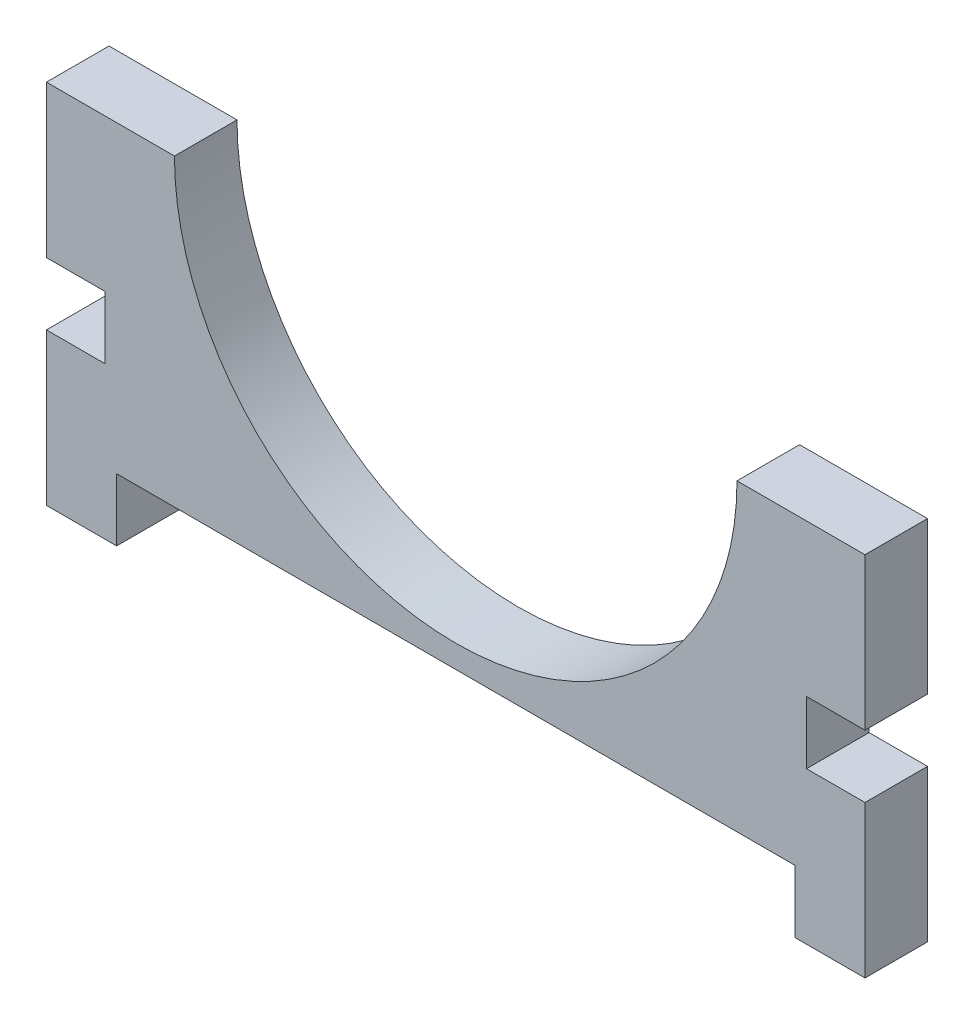
ISO-10303-21;
HEADER;
FILE_DESCRIPTION(('STEP AP214'),'2;1');
FILE_NAME('part.step','',(''),(''),'','','');
FILE_SCHEMA(('AUTOMOTIVE_DESIGN { 1 0 10303 214 1 1 1 1 }'));
ENDSEC;
DATA;
#1=APPLICATION_CONTEXT('core data for automotive mechanical design processes');
#2=APPLICATION_PROTOCOL_DEFINITION('international standard','automotive_design',2000,#1);
#3=PRODUCT_CONTEXT('',#1,'mechanical');
#4=PRODUCT('Part','Part','',(#3));
#5=PRODUCT_RELATED_PRODUCT_CATEGORY('part','',(#4));
#6=PRODUCT_DEFINITION_FORMATION('','',#4);
#7=PRODUCT_DEFINITION_CONTEXT('part definition',#1,'design');
#8=PRODUCT_DEFINITION('design','',#6,#7);
#9=PRODUCT_DEFINITION_SHAPE('','',#8);
#10=(LENGTH_UNIT() NAMED_UNIT(*) SI_UNIT(.MILLI.,.METRE.));
#11=(NAMED_UNIT(*) PLANE_ANGLE_UNIT() SI_UNIT($,.RADIAN.));
#12=(NAMED_UNIT(*) SI_UNIT($,.STERADIAN.) SOLID_ANGLE_UNIT());
#13=UNCERTAINTY_MEASURE_WITH_UNIT(LENGTH_MEASURE(1.E-05),#10,'distance_accuracy_value','');
#14=(GEOMETRIC_REPRESENTATION_CONTEXT(3) GLOBAL_UNCERTAINTY_ASSIGNED_CONTEXT((#13)) GLOBAL_UNIT_ASSIGNED_CONTEXT((#10,
#11,#12)) REPRESENTATION_CONTEXT('',''));
#15=CARTESIAN_POINT('',(0.,0.,0.));
#16=DIRECTION('',(0.,0.,1.));
#17=DIRECTION('',(1.,0.,0.));
#18=AXIS2_PLACEMENT_3D('',#15,#16,#17);
#19=CARTESIAN_POINT('',(-35.,-5.35,5.35));
#20=DIRECTION('',(0.,1.,0.));
#21=DIRECTION('',(0.,0.,1.));
#22=AXIS2_PLACEMENT_3D('',#19,#20,#21);
#23=PLANE('',#22);
#24=DIRECTION('',(1.,0.,0.));
#25=VECTOR('',#24,1.);
#26=CARTESIAN_POINT('',(-35.,-5.35,0.));
#27=LINE('',#26,#25);
#28=CARTESIAN_POINT('',(-35.,-5.35,0.));
#29=VERTEX_POINT('',#28);
#30=CARTESIAN_POINT('',(-29.,-5.35,0.));
#31=VERTEX_POINT('',#30);
#32=EDGE_CURVE('E192',#29,#31,#27,.T.);
#33=ORIENTED_EDGE('',*,*,#32,.T.);
#34=DIRECTION('',(0.,0.,-1.));
#35=VECTOR('',#34,1.);
#36=CARTESIAN_POINT('',(-29.,-5.35,5.35));
#37=LINE('',#36,#35);
#38=CARTESIAN_POINT('',(-29.,-5.35,5.35));
#39=VERTEX_POINT('',#38);
#40=EDGE_CURVE('E40',#39,#31,#37,.T.);
#41=ORIENTED_EDGE('',*,*,#40,.F.);
#42=DIRECTION('',(1.,0.,0.));
#43=VECTOR('',#42,1.);
#44=CARTESIAN_POINT('',(-35.,-5.35,5.35));
#45=LINE('',#44,#43);
#46=CARTESIAN_POINT('',(-35.,-5.35,5.35));
#47=VERTEX_POINT('',#46);
#48=EDGE_CURVE('E122',#47,#39,#45,.T.);
#49=ORIENTED_EDGE('',*,*,#48,.F.);
#50=DIRECTION('',(0.,0.,-1.));
#51=VECTOR('',#50,1.);
#52=CARTESIAN_POINT('',(-35.,-5.35,5.35));
#53=LINE('',#52,#51);
#54=EDGE_CURVE('E11',#47,#29,#53,.T.);
#55=ORIENTED_EDGE('',*,*,#54,.T.);
#56=EDGE_LOOP('',(#33,#41,#49,#55));
#57=FACE_BOUND('',#56,.T.);
#58=ADVANCED_FACE('F32',(#57),#23,.F.);
#59=CARTESIAN_POINT('',(-29.,0.,5.35));
#60=DIRECTION('',(-1.,0.,0.));
#61=DIRECTION('',(0.,-1.,0.));
#62=AXIS2_PLACEMENT_3D('',#59,#60,#61);
#63=PLANE('',#62);
#64=DIRECTION('',(0.,1.,0.));
#65=VECTOR('',#64,1.);
#66=CARTESIAN_POINT('',(-29.,0.,0.));
#67=LINE('',#66,#65);
#68=CARTESIAN_POINT('',(-29.,0.,0.));
#69=VERTEX_POINT('',#68);
#70=EDGE_CURVE('E194',#31,#69,#67,.T.);
#71=ORIENTED_EDGE('',*,*,#70,.T.);
#72=DIRECTION('',(0.,0.,-1.));
#73=VECTOR('',#72,1.);
#74=CARTESIAN_POINT('',(-29.,0.,5.35));
#75=LINE('',#74,#73);
#76=CARTESIAN_POINT('',(-29.,0.,5.35));
#77=VERTEX_POINT('',#76);
#78=EDGE_CURVE('E262',#77,#69,#75,.T.);
#79=ORIENTED_EDGE('',*,*,#78,.F.);
#80=DIRECTION('',(0.,1.,0.));
#81=VECTOR('',#80,1.);
#82=CARTESIAN_POINT('',(-29.,0.,5.35));
#83=LINE('',#82,#81);
#84=EDGE_CURVE('E270',#39,#77,#83,.T.);
#85=ORIENTED_EDGE('',*,*,#84,.F.);
#86=ORIENTED_EDGE('',*,*,#40,.T.);
#87=EDGE_LOOP('',(#71,#79,#85,#86));
#88=FACE_BOUND('',#87,.T.);
#89=ADVANCED_FACE('F268',(#88),#63,.F.);
#90=CARTESIAN_POINT('',(-29.,0.,5.35));
#91=DIRECTION('',(0.,1.,0.));
#92=DIRECTION('',(0.,0.,1.));
#93=AXIS2_PLACEMENT_3D('',#90,#91,#92);
#94=PLANE('',#93);
#95=DIRECTION('',(1.,0.,0.));
#96=VECTOR('',#95,1.);
#97=CARTESIAN_POINT('',(-29.,0.,0.));
#98=LINE('',#97,#96);
#99=CARTESIAN_POINT('',(29.,0.,0.));
#100=VERTEX_POINT('',#99);
#101=EDGE_CURVE('E196',#69,#100,#98,.T.);
#102=ORIENTED_EDGE('',*,*,#101,.T.);
#103=DIRECTION('',(0.,0.,-1.));
#104=VECTOR('',#103,1.);
#105=CARTESIAN_POINT('',(29.,0.,5.35));
#106=LINE('',#105,#104);
#107=CARTESIAN_POINT('',(29.,0.,5.35));
#108=VERTEX_POINT('',#107);
#109=EDGE_CURVE('E259',#108,#100,#106,.T.);
#110=ORIENTED_EDGE('',*,*,#109,.F.);
#111=DIRECTION('',(1.,0.,0.));
#112=VECTOR('',#111,1.);
#113=CARTESIAN_POINT('',(-29.,0.,5.35));
#114=LINE('',#113,#112);
#115=EDGE_CURVE('E289',#77,#108,#114,.T.);
#116=ORIENTED_EDGE('',*,*,#115,.F.);
#117=ORIENTED_EDGE('',*,*,#78,.T.);
#118=EDGE_LOOP('',(#102,#110,#116,#117));
#119=FACE_BOUND('',#118,.T.);
#120=ADVANCED_FACE('F280',(#119),#94,.F.);
#121=CARTESIAN_POINT('',(29.,0.,5.35));
#122=DIRECTION('',(1.,0.,0.));
#123=DIRECTION('',(0.,1.,0.));
#124=AXIS2_PLACEMENT_3D('',#121,#122,#123);
#125=PLANE('',#124);
#126=DIRECTION('',(0.,-1.,0.));
#127=VECTOR('',#126,1.);
#128=CARTESIAN_POINT('',(29.,0.,0.));
#129=LINE('',#128,#127);
#130=CARTESIAN_POINT('',(29.,-5.35,0.));
#131=VERTEX_POINT('',#130);
#132=EDGE_CURVE('E198',#100,#131,#129,.T.);
#133=ORIENTED_EDGE('',*,*,#132,.T.);
#134=DIRECTION('',(0.,0.,-1.));
#135=VECTOR('',#134,1.);
#136=CARTESIAN_POINT('',(29.,-5.35,5.35));
#137=LINE('',#136,#135);
#138=CARTESIAN_POINT('',(29.,-5.35,5.35));
#139=VERTEX_POINT('',#138);
#140=EDGE_CURVE('E256',#139,#131,#137,.T.);
#141=ORIENTED_EDGE('',*,*,#140,.F.);
#142=DIRECTION('',(0.,-1.,0.));
#143=VECTOR('',#142,1.);
#144=CARTESIAN_POINT('',(29.,0.,5.35));
#145=LINE('',#144,#143);
#146=EDGE_CURVE('E286',#108,#139,#145,.T.);
#147=ORIENTED_EDGE('',*,*,#146,.F.);
#148=ORIENTED_EDGE('',*,*,#109,.T.);
#149=EDGE_LOOP('',(#133,#141,#147,#148));
#150=FACE_BOUND('',#149,.T.);
#151=ADVANCED_FACE('F284',(#150),#125,.F.);
#152=CARTESIAN_POINT('',(35.,-5.35,5.35));
#153=DIRECTION('',(0.,1.,0.));
#154=DIRECTION('',(0.,0.,1.));
#155=AXIS2_PLACEMENT_3D('',#152,#153,#154);
#156=PLANE('',#155);
#157=DIRECTION('',(1.,0.,0.));
#158=VECTOR('',#157,1.);
#159=CARTESIAN_POINT('',(35.,-5.35,0.));
#160=LINE('',#159,#158);
#161=CARTESIAN_POINT('',(35.,-5.35,0.));
#162=VERTEX_POINT('',#161);
#163=EDGE_CURVE('E200',#131,#162,#160,.T.);
#164=ORIENTED_EDGE('',*,*,#163,.T.);
#165=DIRECTION('',(0.,0.,-1.));
#166=VECTOR('',#165,1.);
#167=CARTESIAN_POINT('',(35.,-5.35,5.35));
#168=LINE('',#167,#166);
#169=CARTESIAN_POINT('',(35.,-5.35,5.35));
#170=VERTEX_POINT('',#169);
#171=EDGE_CURVE('E253',#170,#162,#168,.T.);
#172=ORIENTED_EDGE('',*,*,#171,.F.);
#173=DIRECTION('',(1.,0.,0.));
#174=VECTOR('',#173,1.);
#175=CARTESIAN_POINT('',(35.,-5.35,5.35));
#176=LINE('',#175,#174);
#177=EDGE_CURVE('E288',#139,#170,#176,.T.);
#178=ORIENTED_EDGE('',*,*,#177,.F.);
#179=ORIENTED_EDGE('',*,*,#140,.T.);
#180=EDGE_LOOP('',(#164,#172,#178,#179));
#181=FACE_BOUND('',#180,.T.);
#182=ADVANCED_FACE('F343',(#181),#156,.F.);
#183=CARTESIAN_POINT('',(35.,-5.31754230471196,5.35));
#184=DIRECTION('',(-1.,0.,0.));
#185=DIRECTION('',(0.,-1.,0.));
#186=AXIS2_PLACEMENT_3D('',#183,#184,#185);
#187=PLANE('',#186);
#188=DIRECTION('',(0.,1.,0.));
#189=VECTOR('',#188,1.);
#190=CARTESIAN_POINT('',(35.,-5.31754230471196,0.));
#191=LINE('',#190,#189);
#192=CARTESIAN_POINT('',(35.,7.65,0.));
#193=VERTEX_POINT('',#192);
#194=EDGE_CURVE('E203',#162,#193,#191,.T.);
#195=ORIENTED_EDGE('',*,*,#194,.T.);
#196=DIRECTION('',(0.,0.,-1.));
#197=VECTOR('',#196,1.);
#198=CARTESIAN_POINT('',(35.,7.65,5.35));
#199=LINE('',#198,#197);
#200=CARTESIAN_POINT('',(35.,7.65,5.35));
#201=VERTEX_POINT('',#200);
#202=EDGE_CURVE('E250',#201,#193,#199,.T.);
#203=ORIENTED_EDGE('',*,*,#202,.F.);
#204=DIRECTION('',(-4.27565410441507E-13,1.,0.));
#205=VECTOR('',#204,1.);
#206=CARTESIAN_POINT('',(35.,-5.31754230471196,5.35));
#207=LINE('',#206,#205);
#208=EDGE_CURVE('E291',#170,#201,#207,.T.);
#209=ORIENTED_EDGE('',*,*,#208,.F.);
#210=ORIENTED_EDGE('',*,*,#171,.T.);
#211=EDGE_LOOP('',(#195,#203,#209,#210));
#212=FACE_BOUND('',#211,.T.);
#213=ADVANCED_FACE('F346',(#212),#187,.F.);
#214=CARTESIAN_POINT('',(35.,7.65,5.35));
#215=DIRECTION('',(0.,-1.,0.));
#216=DIRECTION('',(0.,0.,-1.));
#217=AXIS2_PLACEMENT_3D('',#214,#215,#216);
#218=PLANE('',#217);
#219=DIRECTION('',(-1.,0.,0.));
#220=VECTOR('',#219,1.);
#221=CARTESIAN_POINT('',(35.,7.65,0.));
#222=LINE('',#221,#220);
#223=CARTESIAN_POINT('',(30.,7.65,0.));
#224=VERTEX_POINT('',#223);
#225=EDGE_CURVE('E205',#193,#224,#222,.T.);
#226=ORIENTED_EDGE('',*,*,#225,.T.);
#227=DIRECTION('',(0.,0.,-1.));
#228=VECTOR('',#227,1.);
#229=CARTESIAN_POINT('',(30.,7.65,5.35));
#230=LINE('',#229,#228);
#231=CARTESIAN_POINT('',(30.,7.65,5.35));
#232=VERTEX_POINT('',#231);
#233=EDGE_CURVE('E247',#232,#224,#230,.T.);
#234=ORIENTED_EDGE('',*,*,#233,.F.);
#235=DIRECTION('',(-1.,0.,0.));
#236=VECTOR('',#235,1.);
#237=CARTESIAN_POINT('',(35.,7.65,5.35));
#238=LINE('',#237,#236);
#239=EDGE_CURVE('E297',#201,#232,#238,.T.);
#240=ORIENTED_EDGE('',*,*,#239,.F.);
#241=ORIENTED_EDGE('',*,*,#202,.T.);
#242=EDGE_LOOP('',(#226,#234,#240,#241));
#243=FACE_BOUND('',#242,.T.);
#244=ADVANCED_FACE('F350',(#243),#218,.F.);
#245=CARTESIAN_POINT('',(30.,13.,5.35));
#246=DIRECTION('',(-1.,0.,0.));
#247=DIRECTION('',(0.,0.,1.));
#248=AXIS2_PLACEMENT_3D('',#245,#246,#247);
#249=PLANE('',#248);
#250=DIRECTION('',(0.,1.,0.));
#251=VECTOR('',#250,1.);
#252=CARTESIAN_POINT('',(30.,13.,0.));
#253=LINE('',#252,#251);
#254=CARTESIAN_POINT('',(30.,13.,0.));
#255=VERTEX_POINT('',#254);
#256=EDGE_CURVE('E207',#224,#255,#253,.T.);
#257=ORIENTED_EDGE('',*,*,#256,.T.);
#258=DIRECTION('',(0.,0.,-1.));
#259=VECTOR('',#258,1.);
#260=CARTESIAN_POINT('',(30.,13.,5.35));
#261=LINE('',#260,#259);
#262=CARTESIAN_POINT('',(30.,13.,5.35));
#263=VERTEX_POINT('',#262);
#264=EDGE_CURVE('E244',#263,#255,#261,.T.);
#265=ORIENTED_EDGE('',*,*,#264,.F.);
#266=DIRECTION('',(0.,1.,0.));
#267=VECTOR('',#266,1.);
#268=CARTESIAN_POINT('',(30.,13.,5.35));
#269=LINE('',#268,#267);
#270=EDGE_CURVE('E299',#232,#263,#269,.T.);
#271=ORIENTED_EDGE('',*,*,#270,.F.);
#272=ORIENTED_EDGE('',*,*,#233,.T.);
#273=EDGE_LOOP('',(#257,#265,#271,#272));
#274=FACE_BOUND('',#273,.T.);
#275=ADVANCED_FACE('F354',(#274),#249,.F.);
#276=CARTESIAN_POINT('',(35.,13.,5.35));
#277=DIRECTION('',(0.,1.,0.));
#278=DIRECTION('',(0.,0.,1.));
#279=AXIS2_PLACEMENT_3D('',#276,#277,#278);
#280=PLANE('',#279);
#281=DIRECTION('',(1.,0.,0.));
#282=VECTOR('',#281,1.);
#283=CARTESIAN_POINT('',(35.,13.,0.));
#284=LINE('',#283,#282);
#285=CARTESIAN_POINT('',(35.,13.,0.));
#286=VERTEX_POINT('',#285);
#287=EDGE_CURVE('E209',#255,#286,#284,.T.);
#288=ORIENTED_EDGE('',*,*,#287,.T.);
#289=DIRECTION('',(0.,0.,-1.));
#290=VECTOR('',#289,1.);
#291=CARTESIAN_POINT('',(35.,13.,5.35));
#292=LINE('',#291,#290);
#293=CARTESIAN_POINT('',(35.,13.,5.35));
#294=VERTEX_POINT('',#293);
#295=EDGE_CURVE('E241',#294,#286,#292,.T.);
#296=ORIENTED_EDGE('',*,*,#295,.F.);
#297=DIRECTION('',(1.,0.,0.));
#298=VECTOR('',#297,1.);
#299=CARTESIAN_POINT('',(35.,13.,5.35));
#300=LINE('',#299,#298);
#301=EDGE_CURVE('E301',#263,#294,#300,.T.);
#302=ORIENTED_EDGE('',*,*,#301,.F.);
#303=ORIENTED_EDGE('',*,*,#264,.T.);
#304=EDGE_LOOP('',(#288,#296,#302,#303));
#305=FACE_BOUND('',#304,.T.);
#306=ADVANCED_FACE('F358',(#305),#280,.F.);
#307=CARTESIAN_POINT('',(35.,13.,5.35));
#308=DIRECTION('',(-1.,0.,0.));
#309=DIRECTION('',(0.,0.,1.));
#310=AXIS2_PLACEMENT_3D('',#307,#308,#309);
#311=PLANE('',#310);
#312=DIRECTION('',(0.,1.,0.));
#313=VECTOR('',#312,1.);
#314=CARTESIAN_POINT('',(35.,13.,0.));
#315=LINE('',#314,#313);
#316=CARTESIAN_POINT('',(35.,26.,0.));
#317=VERTEX_POINT('',#316);
#318=EDGE_CURVE('E211',#286,#317,#315,.T.);
#319=ORIENTED_EDGE('',*,*,#318,.T.);
#320=DIRECTION('',(0.,0.,-1.));
#321=VECTOR('',#320,1.);
#322=CARTESIAN_POINT('',(35.,26.,5.35));
#323=LINE('',#322,#321);
#324=CARTESIAN_POINT('',(35.,26.,5.35));
#325=VERTEX_POINT('',#324);
#326=EDGE_CURVE('E238',#325,#317,#323,.T.);
#327=ORIENTED_EDGE('',*,*,#326,.F.);
#328=DIRECTION('',(0.,1.,0.));
#329=VECTOR('',#328,1.);
#330=CARTESIAN_POINT('',(35.,13.,5.35));
#331=LINE('',#330,#329);
#332=EDGE_CURVE('E303',#294,#325,#331,.T.);
#333=ORIENTED_EDGE('',*,*,#332,.F.);
#334=ORIENTED_EDGE('',*,*,#295,.T.);
#335=EDGE_LOOP('',(#319,#327,#333,#334));
#336=FACE_BOUND('',#335,.T.);
#337=ADVANCED_FACE('F362',(#336),#311,.F.);
#338=CARTESIAN_POINT('',(24.055,26.,5.35));
#339=DIRECTION('',(0.,-1.,0.));
#340=DIRECTION('',(1.,0.,0.));
#341=AXIS2_PLACEMENT_3D('',#338,#339,#340);
#342=PLANE('',#341);
#343=DIRECTION('',(-1.,0.,0.));
#344=VECTOR('',#343,1.);
#345=CARTESIAN_POINT('',(24.055,26.,0.));
#346=LINE('',#345,#344);
#347=CARTESIAN_POINT('',(24.055,26.,0.));
#348=VERTEX_POINT('',#347);
#349=EDGE_CURVE('E213',#317,#348,#346,.T.);
#350=ORIENTED_EDGE('',*,*,#349,.T.);
#351=DIRECTION('',(0.,0.,-1.));
#352=VECTOR('',#351,1.);
#353=CARTESIAN_POINT('',(24.055,26.,5.35));
#354=LINE('',#353,#352);
#355=CARTESIAN_POINT('',(24.055,26.,5.35));
#356=VERTEX_POINT('',#355);
#357=EDGE_CURVE('E235',#356,#348,#354,.T.);
#358=ORIENTED_EDGE('',*,*,#357,.F.);
#359=DIRECTION('',(-1.,0.,0.));
#360=VECTOR('',#359,1.);
#361=CARTESIAN_POINT('',(24.055,26.,5.35));
#362=LINE('',#361,#360);
#363=EDGE_CURVE('E305',#325,#356,#362,.T.);
#364=ORIENTED_EDGE('',*,*,#363,.F.);
#365=ORIENTED_EDGE('',*,*,#326,.T.);
#366=EDGE_LOOP('',(#350,#358,#364,#365));
#367=FACE_BOUND('',#366,.T.);
#368=ADVANCED_FACE('F366',(#367),#342,.F.);
#369=CARTESIAN_POINT('',(0.,26.,5.35));
#370=DIRECTION('',(0.,0.,-1.));
#371=DIRECTION('',(-1.,0.,0.));
#372=AXIS2_PLACEMENT_3D('',#369,#370,#371);
#373=CYLINDRICAL_SURFACE('',#372,24.055);
#374=CARTESIAN_POINT('',(0.,26.,0.));
#375=DIRECTION('',(0.,0.,-1.));
#376=DIRECTION('',(1.,0.,0.));
#377=AXIS2_PLACEMENT_3D('',#374,#375,#376);
#378=CIRCLE('',#377,24.055);
#379=CARTESIAN_POINT('',(-24.055,26.,0.));
#380=VERTEX_POINT('',#379);
#381=EDGE_CURVE('E215',#348,#380,#378,.T.);
#382=ORIENTED_EDGE('',*,*,#381,.T.);
#383=DIRECTION('',(0.,0.,-1.));
#384=VECTOR('',#383,1.);
#385=CARTESIAN_POINT('',(-24.055,26.,5.35));
#386=LINE('',#385,#384);
#387=CARTESIAN_POINT('',(-24.055,26.,5.35));
#388=VERTEX_POINT('',#387);
#389=EDGE_CURVE('E232',#388,#380,#386,.T.);
#390=ORIENTED_EDGE('',*,*,#389,.F.);
#391=CARTESIAN_POINT('',(0.,26.,5.35));
#392=DIRECTION('',(0.,0.,-1.));
#393=DIRECTION('',(1.,0.,0.));
#394=AXIS2_PLACEMENT_3D('',#391,#392,#393);
#395=CIRCLE('',#394,24.055);
#396=EDGE_CURVE('E307',#356,#388,#395,.T.);
#397=ORIENTED_EDGE('',*,*,#396,.F.);
#398=ORIENTED_EDGE('',*,*,#357,.T.);
#399=EDGE_LOOP('',(#382,#390,#397,#398));
#400=FACE_BOUND('',#399,.T.);
#401=ADVANCED_FACE('F370',(#400),#373,.F.);
#402=CARTESIAN_POINT('',(-35.,26.,5.35));
#403=DIRECTION('',(0.,-1.,0.));
#404=DIRECTION('',(1.,0.,0.));
#405=AXIS2_PLACEMENT_3D('',#402,#403,#404);
#406=PLANE('',#405);
#407=DIRECTION('',(-1.,0.,0.));
#408=VECTOR('',#407,1.);
#409=CARTESIAN_POINT('',(-35.,26.,0.));
#410=LINE('',#409,#408);
#411=CARTESIAN_POINT('',(-35.,26.,0.));
#412=VERTEX_POINT('',#411);
#413=EDGE_CURVE('E217',#380,#412,#410,.T.);
#414=ORIENTED_EDGE('',*,*,#413,.T.);
#415=DIRECTION('',(0.,0.,-1.));
#416=VECTOR('',#415,1.);
#417=CARTESIAN_POINT('',(-35.,26.,5.35));
#418=LINE('',#417,#416);
#419=CARTESIAN_POINT('',(-35.,26.,5.35));
#420=VERTEX_POINT('',#419);
#421=EDGE_CURVE('E229',#420,#412,#418,.T.);
#422=ORIENTED_EDGE('',*,*,#421,.F.);
#423=DIRECTION('',(-1.,0.,0.));
#424=VECTOR('',#423,1.);
#425=CARTESIAN_POINT('',(-35.,26.,5.35));
#426=LINE('',#425,#424);
#427=EDGE_CURVE('E309',#388,#420,#426,.T.);
#428=ORIENTED_EDGE('',*,*,#427,.F.);
#429=ORIENTED_EDGE('',*,*,#389,.T.);
#430=EDGE_LOOP('',(#414,#422,#428,#429));
#431=FACE_BOUND('',#430,.T.);
#432=ADVANCED_FACE('F315',(#431),#406,.F.);
#433=CARTESIAN_POINT('',(-35.,13.,5.35));
#434=DIRECTION('',(1.,0.,0.));
#435=DIRECTION('',(0.,0.,-1.));
#436=AXIS2_PLACEMENT_3D('',#433,#434,#435);
#437=PLANE('',#436);
#438=DIRECTION('',(0.,-1.,0.));
#439=VECTOR('',#438,1.);
#440=CARTESIAN_POINT('',(-35.,13.,0.));
#441=LINE('',#440,#439);
#442=CARTESIAN_POINT('',(-35.,13.,0.));
#443=VERTEX_POINT('',#442);
#444=EDGE_CURVE('E219',#412,#443,#441,.T.);
#445=ORIENTED_EDGE('',*,*,#444,.T.);
#446=DIRECTION('',(0.,0.,-1.));
#447=VECTOR('',#446,1.);
#448=CARTESIAN_POINT('',(-35.,13.,5.35));
#449=LINE('',#448,#447);
#450=CARTESIAN_POINT('',(-35.,13.,5.35));
#451=VERTEX_POINT('',#450);
#452=EDGE_CURVE('E181',#451,#443,#449,.T.);
#453=ORIENTED_EDGE('',*,*,#452,.F.);
#454=DIRECTION('',(0.,-1.,0.));
#455=VECTOR('',#454,1.);
#456=CARTESIAN_POINT('',(-35.,13.,5.35));
#457=LINE('',#456,#455);
#458=EDGE_CURVE('E172',#420,#451,#457,.T.);
#459=ORIENTED_EDGE('',*,*,#458,.F.);
#460=ORIENTED_EDGE('',*,*,#421,.T.);
#461=EDGE_LOOP('',(#445,#453,#459,#460));
#462=FACE_BOUND('',#461,.T.);
#463=ADVANCED_FACE('F319',(#462),#437,.F.);
#464=CARTESIAN_POINT('',(-35.,13.,5.35));
#465=DIRECTION('',(0.,1.,0.));
#466=DIRECTION('',(0.,0.,1.));
#467=AXIS2_PLACEMENT_3D('',#464,#465,#466);
#468=PLANE('',#467);
#469=DIRECTION('',(1.,0.,0.));
#470=VECTOR('',#469,1.);
#471=CARTESIAN_POINT('',(-35.,13.,0.));
#472=LINE('',#471,#470);
#473=CARTESIAN_POINT('',(-30.,13.,0.));
#474=VERTEX_POINT('',#473);
#475=EDGE_CURVE('E180',#443,#474,#472,.T.);
#476=ORIENTED_EDGE('',*,*,#475,.T.);
#477=DIRECTION('',(0.,0.,-1.));
#478=VECTOR('',#477,1.);
#479=CARTESIAN_POINT('',(-30.,13.,5.35));
#480=LINE('',#479,#478);
#481=CARTESIAN_POINT('',(-30.,13.,5.35));
#482=VERTEX_POINT('',#481);
#483=EDGE_CURVE('E177',#482,#474,#480,.T.);
#484=ORIENTED_EDGE('',*,*,#483,.F.);
#485=DIRECTION('',(1.,0.,0.));
#486=VECTOR('',#485,1.);
#487=CARTESIAN_POINT('',(-35.,13.,5.35));
#488=LINE('',#487,#486);
#489=EDGE_CURVE('E166',#451,#482,#488,.T.);
#490=ORIENTED_EDGE('',*,*,#489,.F.);
#491=ORIENTED_EDGE('',*,*,#452,.T.);
#492=EDGE_LOOP('',(#476,#484,#490,#491));
#493=FACE_BOUND('',#492,.T.);
#494=ADVANCED_FACE('F178',(#493),#468,.F.);
#495=CARTESIAN_POINT('',(-30.,13.,5.35));
#496=DIRECTION('',(1.,0.,0.));
#497=DIRECTION('',(0.,0.,-1.));
#498=AXIS2_PLACEMENT_3D('',#495,#496,#497);
#499=PLANE('',#498);
#500=DIRECTION('',(0.,-1.,0.));
#501=VECTOR('',#500,1.);
#502=CARTESIAN_POINT('',(-30.,13.,0.));
#503=LINE('',#502,#501);
#504=CARTESIAN_POINT('',(-30.,7.65,0.));
#505=VERTEX_POINT('',#504);
#506=EDGE_CURVE('E108',#474,#505,#503,.T.);
#507=ORIENTED_EDGE('',*,*,#506,.T.);
#508=DIRECTION('',(0.,0.,-1.));
#509=VECTOR('',#508,1.);
#510=CARTESIAN_POINT('',(-30.,7.65,5.35));
#511=LINE('',#510,#509);
#512=CARTESIAN_POINT('',(-30.,7.65,5.35));
#513=VERTEX_POINT('',#512);
#514=EDGE_CURVE('E182',#513,#505,#511,.T.);
#515=ORIENTED_EDGE('',*,*,#514,.F.);
#516=DIRECTION('',(0.,-1.,0.));
#517=VECTOR('',#516,1.);
#518=CARTESIAN_POINT('',(-30.,13.,5.35));
#519=LINE('',#518,#517);
#520=EDGE_CURVE('E170',#482,#513,#519,.T.);
#521=ORIENTED_EDGE('',*,*,#520,.F.);
#522=ORIENTED_EDGE('',*,*,#483,.T.);
#523=EDGE_LOOP('',(#507,#515,#521,#522));
#524=FACE_BOUND('',#523,.T.);
#525=ADVANCED_FACE('F184',(#524),#499,.F.);
#526=CARTESIAN_POINT('',(-35.,7.65,5.35));
#527=DIRECTION('',(0.,-1.,0.));
#528=DIRECTION('',(0.,0.,-1.));
#529=AXIS2_PLACEMENT_3D('',#526,#527,#528);
#530=PLANE('',#529);
#531=DIRECTION('',(-1.,0.,0.));
#532=VECTOR('',#531,1.);
#533=CARTESIAN_POINT('',(-35.,7.65,0.));
#534=LINE('',#533,#532);
#535=CARTESIAN_POINT('',(-35.,7.65,0.));
#536=VERTEX_POINT('',#535);
#537=EDGE_CURVE('E115',#505,#536,#534,.T.);
#538=ORIENTED_EDGE('',*,*,#537,.T.);
#539=DIRECTION('',(0.,0.,-1.));
#540=VECTOR('',#539,1.);
#541=CARTESIAN_POINT('',(-35.,7.65,5.35));
#542=LINE('',#541,#540);
#543=CARTESIAN_POINT('',(-35.,7.65,5.35));
#544=VERTEX_POINT('',#543);
#545=EDGE_CURVE('E188',#544,#536,#542,.T.);
#546=ORIENTED_EDGE('',*,*,#545,.F.);
#547=DIRECTION('',(-1.,0.,0.));
#548=VECTOR('',#547,1.);
#549=CARTESIAN_POINT('',(-35.,7.65,5.35));
#550=LINE('',#549,#548);
#551=EDGE_CURVE('E186',#513,#544,#550,.T.);
#552=ORIENTED_EDGE('',*,*,#551,.F.);
#553=ORIENTED_EDGE('',*,*,#514,.T.);
#554=EDGE_LOOP('',(#538,#546,#552,#553));
#555=FACE_BOUND('',#554,.T.);
#556=ADVANCED_FACE('F321',(#555),#530,.F.);
#557=CARTESIAN_POINT('',(-35.,-5.31754230471196,5.35));
#558=DIRECTION('',(1.,0.,0.));
#559=DIRECTION('',(0.,0.,-1.));
#560=AXIS2_PLACEMENT_3D('',#557,#558,#559);
#561=PLANE('',#560);
#562=DIRECTION('',(0.,-1.,0.));
#563=VECTOR('',#562,1.);
#564=CARTESIAN_POINT('',(-35.,-5.31754230471196,0.));
#565=LINE('',#564,#563);
#566=EDGE_CURVE('E224',#536,#29,#565,.T.);
#567=ORIENTED_EDGE('',*,*,#566,.T.);
#568=ORIENTED_EDGE('',*,*,#54,.F.);
#569=DIRECTION('',(4.27565410441415E-13,-1.,0.));
#570=VECTOR('',#569,1.);
#571=CARTESIAN_POINT('',(-35.,-5.31754230471196,5.35));
#572=LINE('',#571,#570);
#573=EDGE_CURVE('E48',#544,#47,#572,.T.);
#574=ORIENTED_EDGE('',*,*,#573,.F.);
#575=ORIENTED_EDGE('',*,*,#545,.T.);
#576=EDGE_LOOP('',(#567,#568,#574,#575));
#577=FACE_BOUND('',#576,.T.);
#578=ADVANCED_FACE('F320',(#577),#561,.F.);
#579=CARTESIAN_POINT('',(0.,26.,5.35));
#580=DIRECTION('',(0.,0.,1.));
#581=DIRECTION('',(1.,0.,0.));
#582=AXIS2_PLACEMENT_3D('',#579,#580,#581);
#583=PLANE('',#582);
#584=ORIENTED_EDGE('',*,*,#573,.T.);
#585=ORIENTED_EDGE('',*,*,#48,.T.);
#586=ORIENTED_EDGE('',*,*,#84,.T.);
#587=ORIENTED_EDGE('',*,*,#115,.T.);
#588=ORIENTED_EDGE('',*,*,#146,.T.);
#589=ORIENTED_EDGE('',*,*,#177,.T.);
#590=ORIENTED_EDGE('',*,*,#208,.T.);
#591=ORIENTED_EDGE('',*,*,#239,.T.);
#592=ORIENTED_EDGE('',*,*,#270,.T.);
#593=ORIENTED_EDGE('',*,*,#301,.T.);
#594=ORIENTED_EDGE('',*,*,#332,.T.);
#595=ORIENTED_EDGE('',*,*,#363,.T.);
#596=ORIENTED_EDGE('',*,*,#396,.T.);
#597=ORIENTED_EDGE('',*,*,#427,.T.);
#598=ORIENTED_EDGE('',*,*,#458,.T.);
#599=ORIENTED_EDGE('',*,*,#489,.T.);
#600=ORIENTED_EDGE('',*,*,#520,.T.);
#601=ORIENTED_EDGE('',*,*,#551,.T.);
#602=EDGE_LOOP('',(#584,#585,#586,#587,#588,#589,#590,#591,#592,#593,#594,#595,#596,#597,#598,
#599,#600,#601));
#603=FACE_BOUND('',#602,.T.);
#604=ADVANCED_FACE('F168',(#603),#583,.T.);
#605=CARTESIAN_POINT('',(0.,26.,0.));
#606=DIRECTION('',(0.,0.,1.));
#607=DIRECTION('',(1.,0.,0.));
#608=AXIS2_PLACEMENT_3D('',#605,#606,#607);
#609=PLANE('',#608);
#610=ORIENTED_EDGE('',*,*,#32,.F.);
#611=ORIENTED_EDGE('',*,*,#566,.F.);
#612=ORIENTED_EDGE('',*,*,#537,.F.);
#613=ORIENTED_EDGE('',*,*,#506,.F.);
#614=ORIENTED_EDGE('',*,*,#475,.F.);
#615=ORIENTED_EDGE('',*,*,#444,.F.);
#616=ORIENTED_EDGE('',*,*,#413,.F.);
#617=ORIENTED_EDGE('',*,*,#381,.F.);
#618=ORIENTED_EDGE('',*,*,#349,.F.);
#619=ORIENTED_EDGE('',*,*,#318,.F.);
#620=ORIENTED_EDGE('',*,*,#287,.F.);
#621=ORIENTED_EDGE('',*,*,#256,.F.);
#622=ORIENTED_EDGE('',*,*,#225,.F.);
#623=ORIENTED_EDGE('',*,*,#194,.F.);
#624=ORIENTED_EDGE('',*,*,#163,.F.);
#625=ORIENTED_EDGE('',*,*,#132,.F.);
#626=ORIENTED_EDGE('',*,*,#101,.F.);
#627=ORIENTED_EDGE('',*,*,#70,.F.);
#628=EDGE_LOOP('',(#610,#611,#612,#613,#614,#615,#616,#617,#618,#619,#620,#621,#622,#623,#624,
#625,#626,#627));
#629=FACE_BOUND('',#628,.T.);
#630=ADVANCED_FACE('F274',(#629),#609,.F.);
#631=CLOSED_SHELL('',(#58,#89,#120,#151,#182,#213,#244,#275,#306,#337,#368,#401,#432,#463,#494,
#525,#556,#578,#604,#630));
#632=MANIFOLD_SOLID_BREP('B2',#631);
#633=ADVANCED_BREP_SHAPE_REPRESENTATION('',(#18,#632),#14);
#634=SHAPE_DEFINITION_REPRESENTATION(#9,#633);
ENDSEC;
END-ISO-10303-21;
